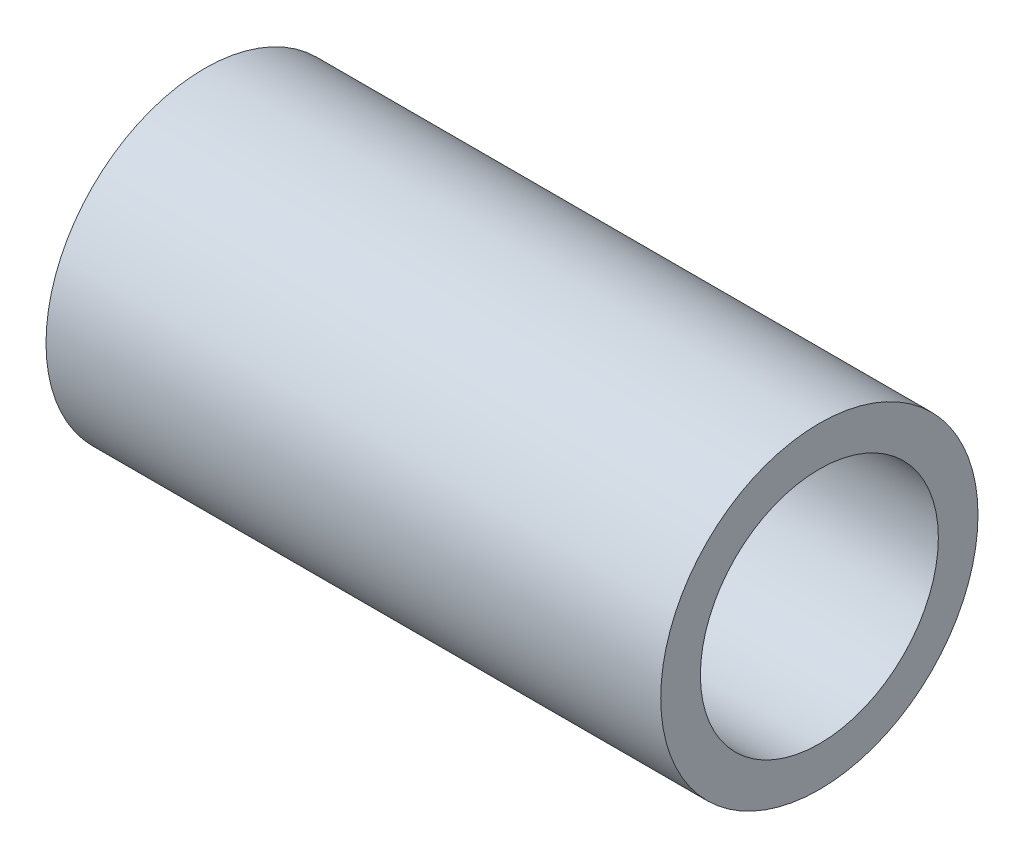
ISO-10303-21;
HEADER;
FILE_DESCRIPTION(('STEP AP214'),'2;1');
FILE_NAME('part.step','',(''),(''),'','','');
FILE_SCHEMA(('AUTOMOTIVE_DESIGN { 1 0 10303 214 1 1 1 1 }'));
ENDSEC;
DATA;
#1=APPLICATION_CONTEXT('core data for automotive mechanical design processes');
#2=APPLICATION_PROTOCOL_DEFINITION('international standard','automotive_design',2000,#1);
#3=PRODUCT_CONTEXT('',#1,'mechanical');
#4=PRODUCT('Part','Part','',(#3));
#5=PRODUCT_RELATED_PRODUCT_CATEGORY('part','',(#4));
#6=PRODUCT_DEFINITION_FORMATION('','',#4);
#7=PRODUCT_DEFINITION_CONTEXT('part definition',#1,'design');
#8=PRODUCT_DEFINITION('design','',#6,#7);
#9=PRODUCT_DEFINITION_SHAPE('','',#8);
#10=(LENGTH_UNIT() NAMED_UNIT(*) SI_UNIT(.MILLI.,.METRE.));
#11=(NAMED_UNIT(*) PLANE_ANGLE_UNIT() SI_UNIT($,.RADIAN.));
#12=(NAMED_UNIT(*) SI_UNIT($,.STERADIAN.) SOLID_ANGLE_UNIT());
#13=UNCERTAINTY_MEASURE_WITH_UNIT(LENGTH_MEASURE(1.E-05),#10,'distance_accuracy_value','');
#14=(GEOMETRIC_REPRESENTATION_CONTEXT(3) GLOBAL_UNCERTAINTY_ASSIGNED_CONTEXT((#13)) GLOBAL_UNIT_ASSIGNED_CONTEXT((#10,
#11,#12)) REPRESENTATION_CONTEXT('',''));
#15=CARTESIAN_POINT('',(0.,0.,0.));
#16=DIRECTION('',(0.,0.,1.));
#17=DIRECTION('',(1.,0.,0.));
#18=AXIS2_PLACEMENT_3D('',#15,#16,#17);
#19=CARTESIAN_POINT('',(0.,0.,0.));
#20=DIRECTION('',(1.,0.,0.));
#21=DIRECTION('',(0.,0.,-1.));
#22=AXIS2_PLACEMENT_3D('',#19,#20,#21);
#23=PLANE('',#22);
#24=CARTESIAN_POINT('',(0.,0.,0.));
#25=DIRECTION('',(-1.,0.,0.));
#26=DIRECTION('',(0.,0.,1.));
#27=AXIS2_PLACEMENT_3D('',#24,#25,#26);
#28=CIRCLE('',#27,4.);
#29=CARTESIAN_POINT('',(0.,0.,4.));
#30=VERTEX_POINT('',#29);
#31=EDGE_CURVE('E96',#30,#30,#28,.T.);
#32=ORIENTED_EDGE('',*,*,#31,.T.);
#33=EDGE_LOOP('',(#32));
#34=FACE_BOUND('',#33,.T.);
#35=CARTESIAN_POINT('',(0.,0.,0.));
#36=DIRECTION('',(1.,0.,0.));
#37=DIRECTION('',(0.,0.,-1.));
#38=AXIS2_PLACEMENT_3D('',#35,#36,#37);
#39=CIRCLE('',#38,3.);
#40=CARTESIAN_POINT('',(0.,0.,-3.));
#41=VERTEX_POINT('',#40);
#42=EDGE_CURVE('E51',#41,#41,#39,.F.);
#43=ORIENTED_EDGE('',*,*,#42,.F.);
#44=EDGE_LOOP('',(#43));
#45=FACE_BOUND('',#44,.T.);
#46=ADVANCED_FACE('F82',(#34,#45),#23,.F.);
#47=CARTESIAN_POINT('',(15.5,0.,0.));
#48=DIRECTION('',(-1.,0.,0.));
#49=DIRECTION('',(0.,0.,1.));
#50=AXIS2_PLACEMENT_3D('',#47,#48,#49);
#51=PLANE('',#50);
#52=CARTESIAN_POINT('',(15.5,0.,0.));
#53=DIRECTION('',(-1.,0.,0.));
#54=DIRECTION('',(0.,0.,1.));
#55=AXIS2_PLACEMENT_3D('',#52,#53,#54);
#56=CIRCLE('',#55,4.);
#57=CARTESIAN_POINT('',(15.5,0.,4.));
#58=VERTEX_POINT('',#57);
#59=EDGE_CURVE('E103',#58,#58,#56,.T.);
#60=ORIENTED_EDGE('',*,*,#59,.F.);
#61=EDGE_LOOP('',(#60));
#62=FACE_BOUND('',#61,.T.);
#63=CARTESIAN_POINT('',(15.5,0.,0.));
#64=DIRECTION('',(-1.,0.,0.));
#65=DIRECTION('',(0.,0.,1.));
#66=AXIS2_PLACEMENT_3D('',#63,#64,#65);
#67=CIRCLE('',#66,3.);
#68=CARTESIAN_POINT('',(15.5,0.,3.));
#69=VERTEX_POINT('',#68);
#70=EDGE_CURVE('E89',#69,#69,#67,.F.);
#71=ORIENTED_EDGE('',*,*,#70,.F.);
#72=EDGE_LOOP('',(#71));
#73=FACE_BOUND('',#72,.T.);
#74=ADVANCED_FACE('F113',(#62,#73),#51,.F.);
#75=CARTESIAN_POINT('',(0.,0.,0.));
#76=DIRECTION('',(-1.,0.,0.));
#77=DIRECTION('',(0.,0.,1.));
#78=AXIS2_PLACEMENT_3D('',#75,#76,#77);
#79=CYLINDRICAL_SURFACE('',#78,4.);
#80=ORIENTED_EDGE('',*,*,#31,.F.);
#81=EDGE_LOOP('',(#80));
#82=FACE_BOUND('',#81,.T.);
#83=ORIENTED_EDGE('',*,*,#59,.T.);
#84=EDGE_LOOP('',(#83));
#85=FACE_BOUND('',#84,.T.);
#86=ADVANCED_FACE('F111',(#82,#85),#79,.T.);
#87=CARTESIAN_POINT('',(0.,0.,0.));
#88=DIRECTION('',(1.,0.,0.));
#89=DIRECTION('',(0.,0.,-1.));
#90=AXIS2_PLACEMENT_3D('',#87,#88,#89);
#91=CYLINDRICAL_SURFACE('',#90,3.);
#92=ORIENTED_EDGE('',*,*,#70,.T.);
#93=EDGE_LOOP('',(#92));
#94=FACE_BOUND('',#93,.T.);
#95=ORIENTED_EDGE('',*,*,#42,.T.);
#96=EDGE_LOOP('',(#95));
#97=FACE_BOUND('',#96,.T.);
#98=ADVANCED_FACE('F121',(#94,#97),#91,.F.);
#99=CLOSED_SHELL('',(#46,#74,#86,#98));
#100=MANIFOLD_SOLID_BREP('B6',#99);
#101=ADVANCED_BREP_SHAPE_REPRESENTATION('',(#18,#100),#14);
#102=SHAPE_DEFINITION_REPRESENTATION(#9,#101);
ENDSEC;
END-ISO-10303-21;
